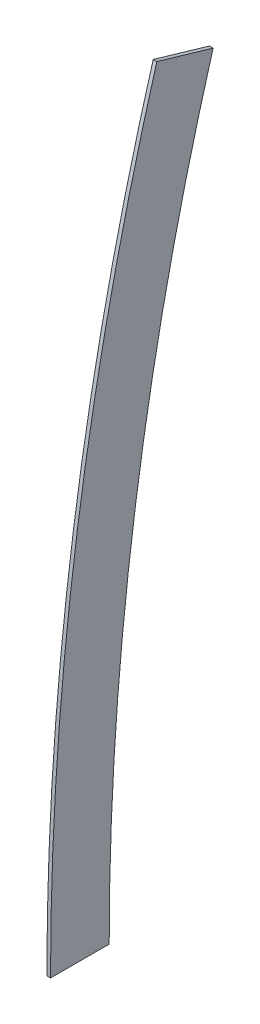
ISO-10303-21;
HEADER;
FILE_DESCRIPTION(('STEP AP214'),'2;1');
FILE_NAME('part.step','',(''),(''),'','','');
FILE_SCHEMA(('AUTOMOTIVE_DESIGN { 1 0 10303 214 1 1 1 1 }'));
ENDSEC;
DATA;
#1=APPLICATION_CONTEXT('core data for automotive mechanical design processes');
#2=APPLICATION_PROTOCOL_DEFINITION('international standard','automotive_design',2000,#1);
#3=PRODUCT_CONTEXT('',#1,'mechanical');
#4=PRODUCT('Part','Part','',(#3));
#5=PRODUCT_RELATED_PRODUCT_CATEGORY('part','',(#4));
#6=PRODUCT_DEFINITION_FORMATION('','',#4);
#7=PRODUCT_DEFINITION_CONTEXT('part definition',#1,'design');
#8=PRODUCT_DEFINITION('design','',#6,#7);
#9=PRODUCT_DEFINITION_SHAPE('','',#8);
#10=(LENGTH_UNIT() NAMED_UNIT(*) SI_UNIT(.MILLI.,.METRE.));
#11=(NAMED_UNIT(*) PLANE_ANGLE_UNIT() SI_UNIT($,.RADIAN.));
#12=(NAMED_UNIT(*) SI_UNIT($,.STERADIAN.) SOLID_ANGLE_UNIT());
#13=UNCERTAINTY_MEASURE_WITH_UNIT(LENGTH_MEASURE(1.E-05),#10,'distance_accuracy_value','');
#14=(GEOMETRIC_REPRESENTATION_CONTEXT(3) GLOBAL_UNCERTAINTY_ASSIGNED_CONTEXT((#13)) GLOBAL_UNIT_ASSIGNED_CONTEXT((#10,
#11,#12)) REPRESENTATION_CONTEXT('',''));
#15=CARTESIAN_POINT('',(0.,0.,0.));
#16=DIRECTION('',(0.,0.,1.));
#17=DIRECTION('',(1.,0.,0.));
#18=AXIS2_PLACEMENT_3D('',#15,#16,#17);
#19=CARTESIAN_POINT('',(-1.5875,0.,-1139.85237068966));
#20=DIRECTION('',(1.,0.,0.));
#21=DIRECTION('',(0.,0.,-1.));
#22=AXIS2_PLACEMENT_3D('',#19,#20,#21);
#23=CYLINDRICAL_SURFACE('',#22,1114.45237068966);
#24=CARTESIAN_POINT('',(0.,0.,-1139.85237068966));
#25=DIRECTION('',(-1.,0.,0.));
#26=DIRECTION('',(0.,0.,1.));
#27=AXIS2_PLACEMENT_3D('',#24,#25,#26);
#28=CIRCLE('',#27,1114.45237068966);
#29=CARTESIAN_POINT('',(0.,0.,-25.4000000000003));
#30=VERTEX_POINT('',#29);
#31=CARTESIAN_POINT('',(0.,313.529210589507,-70.4116193420581));
#32=VERTEX_POINT('',#31);
#33=EDGE_CURVE('E100',#30,#32,#28,.T.);
#34=ORIENTED_EDGE('',*,*,#33,.F.);
#35=DIRECTION('',(1.,0.,0.));
#36=VECTOR('',#35,1.);
#37=CARTESIAN_POINT('',(-1.5875,0.,-25.4000000000003));
#38=LINE('',#37,#36);
#39=CARTESIAN_POINT('',(-1.5875,0.,-25.4000000000003));
#40=VERTEX_POINT('',#39);
#41=EDGE_CURVE('E11',#40,#30,#38,.T.);
#42=ORIENTED_EDGE('',*,*,#41,.F.);
#43=CARTESIAN_POINT('',(-1.5875,0.,-1139.85237068966));
#44=DIRECTION('',(-1.,0.,0.));
#45=DIRECTION('',(0.,0.,1.));
#46=AXIS2_PLACEMENT_3D('',#43,#44,#45);
#47=CIRCLE('',#46,1114.45237068966);
#48=CARTESIAN_POINT('',(-1.5875,313.529210589507,-70.4116193420581));
#49=VERTEX_POINT('',#48);
#50=EDGE_CURVE('E94',#40,#49,#47,.T.);
#51=ORIENTED_EDGE('',*,*,#50,.T.);
#52=DIRECTION('',(1.,0.,0.));
#53=VECTOR('',#52,1.);
#54=CARTESIAN_POINT('',(-1.5875,313.529210589507,-70.4116193420581));
#55=LINE('',#54,#53);
#56=EDGE_CURVE('E39',#49,#32,#55,.T.);
#57=ORIENTED_EDGE('',*,*,#56,.T.);
#58=EDGE_LOOP('',(#34,#42,#51,#57));
#59=FACE_BOUND('',#58,.T.);
#60=ADVANCED_FACE('F36',(#59),#23,.F.);
#61=CARTESIAN_POINT('',(-1.5875,0.,0.));
#62=DIRECTION('',(0.,-1.,0.));
#63=DIRECTION('',(0.,0.,-1.));
#64=AXIS2_PLACEMENT_3D('',#61,#62,#63);
#65=PLANE('',#64);
#66=DIRECTION('',(0.,0.,-1.));
#67=VECTOR('',#66,1.);
#68=CARTESIAN_POINT('',(0.,0.,0.));
#69=LINE('',#68,#67);
#70=CARTESIAN_POINT('',(0.,0.,0.));
#71=VERTEX_POINT('',#70);
#72=EDGE_CURVE('E96',#71,#30,#69,.T.);
#73=ORIENTED_EDGE('',*,*,#72,.F.);
#74=DIRECTION('',(1.,0.,0.));
#75=VECTOR('',#74,1.);
#76=CARTESIAN_POINT('',(-1.5875,0.,0.));
#77=LINE('',#76,#75);
#78=CARTESIAN_POINT('',(-1.5875,0.,0.));
#79=VERTEX_POINT('',#78);
#80=EDGE_CURVE('E45',#79,#71,#77,.T.);
#81=ORIENTED_EDGE('',*,*,#80,.F.);
#82=DIRECTION('',(0.,0.,-1.));
#83=VECTOR('',#82,1.);
#84=CARTESIAN_POINT('',(-1.5875,0.,0.));
#85=LINE('',#84,#83);
#86=EDGE_CURVE('E91',#79,#40,#85,.T.);
#87=ORIENTED_EDGE('',*,*,#86,.T.);
#88=ORIENTED_EDGE('',*,*,#41,.T.);
#89=EDGE_LOOP('',(#73,#81,#87,#88));
#90=FACE_BOUND('',#89,.T.);
#91=ADVANCED_FACE('F110',(#90),#65,.T.);
#92=CARTESIAN_POINT('',(-1.5875,0.,-1139.85237068966));
#93=DIRECTION('',(1.,0.,0.));
#94=DIRECTION('',(0.,0.,-1.));
#95=AXIS2_PLACEMENT_3D('',#92,#93,#94);
#96=CYLINDRICAL_SURFACE('',#95,1139.85237068966);
#97=CARTESIAN_POINT('',(0.,0.,-1139.85237068966));
#98=DIRECTION('',(1.,0.,0.));
#99=DIRECTION('',(0.,0.,1.));
#100=AXIS2_PLACEMENT_3D('',#97,#98,#99);
#101=CIRCLE('',#100,1139.85237068966);
#102=CARTESIAN_POINT('',(0.,320.675,-46.0375));
#103=VERTEX_POINT('',#102);
#104=EDGE_CURVE('E86',#103,#71,#101,.T.);
#105=ORIENTED_EDGE('',*,*,#104,.F.);
#106=DIRECTION('',(1.,0.,0.));
#107=VECTOR('',#106,1.);
#108=CARTESIAN_POINT('',(-1.5875,320.675,-46.0375));
#109=LINE('',#108,#107);
#110=CARTESIAN_POINT('',(-1.5875,320.675,-46.0375));
#111=VERTEX_POINT('',#110);
#112=EDGE_CURVE('E81',#111,#103,#109,.T.);
#113=ORIENTED_EDGE('',*,*,#112,.F.);
#114=CARTESIAN_POINT('',(-1.5875,0.,-1139.85237068966));
#115=DIRECTION('',(1.,0.,0.));
#116=DIRECTION('',(0.,0.,1.));
#117=AXIS2_PLACEMENT_3D('',#114,#115,#116);
#118=CIRCLE('',#117,1139.85237068966);
#119=EDGE_CURVE('E84',#111,#79,#118,.T.);
#120=ORIENTED_EDGE('',*,*,#119,.T.);
#121=ORIENTED_EDGE('',*,*,#80,.T.);
#122=EDGE_LOOP('',(#105,#113,#120,#121));
#123=FACE_BOUND('',#122,.T.);
#124=ADVANCED_FACE('F83',(#123),#96,.T.);
#125=CARTESIAN_POINT('',(-1.5875,313.529210589507,-70.4116193420581));
#126=DIRECTION('',(0.,0.959610997718815,-0.281330291751707));
#127=DIRECTION('',(0.,0.281330291751707,0.959610997718815));
#128=AXIS2_PLACEMENT_3D('',#125,#126,#127);
#129=PLANE('',#128);
#130=DIRECTION('',(0.,0.281330291751707,0.959610997718815));
#131=VECTOR('',#130,1.);
#132=CARTESIAN_POINT('',(0.,313.529210589507,-70.4116193420581));
#133=LINE('',#132,#131);
#134=EDGE_CURVE('E103',#32,#103,#133,.T.);
#135=ORIENTED_EDGE('',*,*,#134,.F.);
#136=ORIENTED_EDGE('',*,*,#56,.F.);
#137=DIRECTION('',(0.,0.281330291751707,0.959610997718815));
#138=VECTOR('',#137,1.);
#139=CARTESIAN_POINT('',(-1.5875,313.529210589507,-70.4116193420581));
#140=LINE('',#139,#138);
#141=EDGE_CURVE('E90',#49,#111,#140,.T.);
#142=ORIENTED_EDGE('',*,*,#141,.T.);
#143=ORIENTED_EDGE('',*,*,#112,.T.);
#144=EDGE_LOOP('',(#135,#136,#142,#143));
#145=FACE_BOUND('',#144,.T.);
#146=ADVANCED_FACE('F93',(#145),#129,.T.);
#147=CARTESIAN_POINT('',(-1.5875,0.,-1139.85237068966));
#148=DIRECTION('',(-1.,0.,0.));
#149=DIRECTION('',(0.,0.,1.));
#150=AXIS2_PLACEMENT_3D('',#147,#148,#149);
#151=PLANE('',#150);
#152=ORIENTED_EDGE('',*,*,#50,.F.);
#153=ORIENTED_EDGE('',*,*,#86,.F.);
#154=ORIENTED_EDGE('',*,*,#119,.F.);
#155=ORIENTED_EDGE('',*,*,#141,.F.);
#156=EDGE_LOOP('',(#152,#153,#154,#155));
#157=FACE_BOUND('',#156,.T.);
#158=ADVANCED_FACE('F89',(#157),#151,.T.);
#159=CARTESIAN_POINT('',(0.,0.,-1139.85237068966));
#160=DIRECTION('',(-1.,0.,0.));
#161=DIRECTION('',(0.,0.,1.));
#162=AXIS2_PLACEMENT_3D('',#159,#160,#161);
#163=PLANE('',#162);
#164=ORIENTED_EDGE('',*,*,#33,.T.);
#165=ORIENTED_EDGE('',*,*,#134,.T.);
#166=ORIENTED_EDGE('',*,*,#104,.T.);
#167=ORIENTED_EDGE('',*,*,#72,.T.);
#168=EDGE_LOOP('',(#164,#165,#166,#167));
#169=FACE_BOUND('',#168,.T.);
#170=ADVANCED_FACE('F109',(#169),#163,.F.);
#171=CLOSED_SHELL('',(#60,#91,#124,#146,#158,#170));
#172=MANIFOLD_SOLID_BREP('B2',#171);
#173=ADVANCED_BREP_SHAPE_REPRESENTATION('',(#18,#172),#14);
#174=SHAPE_DEFINITION_REPRESENTATION(#9,#173);
ENDSEC;
END-ISO-10303-21;
